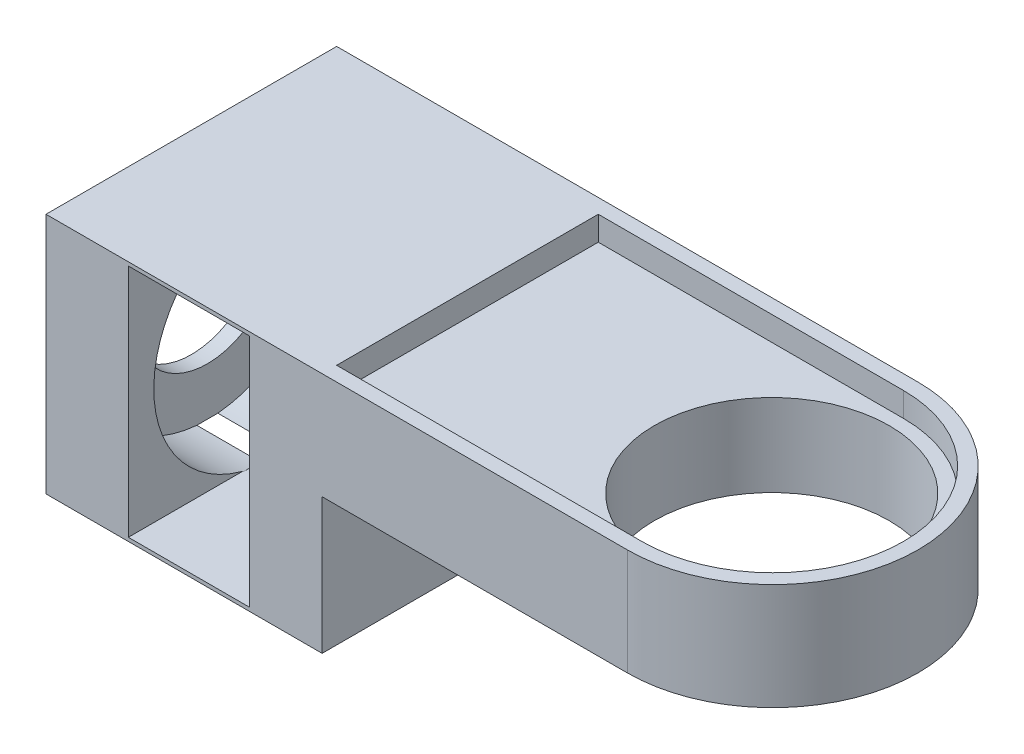
ISO-10303-21;
HEADER;
FILE_DESCRIPTION(('STEP AP214'),'2;1');
FILE_NAME('part.step','',(''),(''),'','','');
FILE_SCHEMA(('AUTOMOTIVE_DESIGN { 1 0 10303 214 1 1 1 1 }'));
ENDSEC;
DATA;
#1=APPLICATION_CONTEXT('core data for automotive mechanical design processes');
#2=APPLICATION_PROTOCOL_DEFINITION('international standard','automotive_design',2000,#1);
#3=PRODUCT_CONTEXT('',#1,'mechanical');
#4=PRODUCT('Part','Part','',(#3));
#5=PRODUCT_RELATED_PRODUCT_CATEGORY('part','',(#4));
#6=PRODUCT_DEFINITION_FORMATION('','',#4);
#7=PRODUCT_DEFINITION_CONTEXT('part definition',#1,'design');
#8=PRODUCT_DEFINITION('design','',#6,#7);
#9=PRODUCT_DEFINITION_SHAPE('','',#8);
#10=(LENGTH_UNIT() NAMED_UNIT(*) SI_UNIT(.MILLI.,.METRE.));
#11=(NAMED_UNIT(*) PLANE_ANGLE_UNIT() SI_UNIT($,.RADIAN.));
#12=(NAMED_UNIT(*) SI_UNIT($,.STERADIAN.) SOLID_ANGLE_UNIT());
#13=UNCERTAINTY_MEASURE_WITH_UNIT(LENGTH_MEASURE(1.E-05),#10,'distance_accuracy_value','');
#14=(GEOMETRIC_REPRESENTATION_CONTEXT(3) GLOBAL_UNCERTAINTY_ASSIGNED_CONTEXT((#13)) GLOBAL_UNIT_ASSIGNED_CONTEXT((#10,
#11,#12)) REPRESENTATION_CONTEXT('',''));
#15=CARTESIAN_POINT('',(0.,0.,0.));
#16=DIRECTION('',(0.,0.,1.));
#17=DIRECTION('',(1.,0.,0.));
#18=AXIS2_PLACEMENT_3D('',#15,#16,#17);
#19=CARTESIAN_POINT('',(0.,-56.,0.));
#20=DIRECTION('',(0.,-1.,0.));
#21=DIRECTION('',(0.,0.,-1.));
#22=AXIS2_PLACEMENT_3D('',#19,#20,#21);
#23=PLANE('',#22);
#24=DIRECTION('',(0.,0.,-1.));
#25=VECTOR('',#24,1.);
#26=CARTESIAN_POINT('',(-150.,-56.,-60.));
#27=LINE('',#26,#25);
#28=CARTESIAN_POINT('',(-150.,-56.,60.));
#29=VERTEX_POINT('',#28);
#30=CARTESIAN_POINT('',(-150.,-56.,-60.));
#31=VERTEX_POINT('',#30);
#32=EDGE_CURVE('E309',#29,#31,#27,.T.);
#33=ORIENTED_EDGE('',*,*,#32,.T.);
#34=DIRECTION('',(1.,0.,0.));
#35=VECTOR('',#34,1.);
#36=CARTESIAN_POINT('',(-36.,-56.,-60.));
#37=LINE('',#36,#35);
#38=CARTESIAN_POINT('',(-36.,-56.,-60.));
#39=VERTEX_POINT('',#38);
#40=EDGE_CURVE('E317',#31,#39,#37,.T.);
#41=ORIENTED_EDGE('',*,*,#40,.T.);
#42=DIRECTION('',(0.,0.,1.));
#43=VECTOR('',#42,1.);
#44=CARTESIAN_POINT('',(-36.,-56.,-60.));
#45=LINE('',#44,#43);
#46=CARTESIAN_POINT('',(-36.,-56.,60.));
#47=VERTEX_POINT('',#46);
#48=EDGE_CURVE('E314',#39,#47,#45,.T.);
#49=ORIENTED_EDGE('',*,*,#48,.T.);
#50=DIRECTION('',(-1.,0.,0.));
#51=VECTOR('',#50,1.);
#52=CARTESIAN_POINT('',(-36.,-56.,60.));
#53=LINE('',#52,#51);
#54=EDGE_CURVE('E304',#47,#29,#53,.T.);
#55=ORIENTED_EDGE('',*,*,#54,.T.);
#56=EDGE_LOOP('',(#33,#41,#49,#55));
#57=FACE_BOUND('',#56,.T.);
#58=DIRECTION('',(-1.,0.,0.));
#59=VECTOR('',#58,1.);
#60=CARTESIAN_POINT('',(-115.7,-56.,4.33047170531338));
#61=LINE('',#60,#59);
#62=CARTESIAN_POINT('',(-115.7,-56.,4.33047170531338));
#63=VERTEX_POINT('',#62);
#64=CARTESIAN_POINT('',(-143.4,-56.,4.33047170531338));
#65=VERTEX_POINT('',#64);
#66=EDGE_CURVE('E376',#63,#65,#61,.T.);
#67=ORIENTED_EDGE('',*,*,#66,.F.);
#68=DIRECTION('',(0.,0.,-1.));
#69=VECTOR('',#68,1.);
#70=CARTESIAN_POINT('',(-115.7,-56.,0.));
#71=LINE('',#70,#69);
#72=CARTESIAN_POINT('',(-115.7,-56.,-4.33047170531338));
#73=VERTEX_POINT('',#72);
#74=EDGE_CURVE('E394',#63,#73,#71,.T.);
#75=ORIENTED_EDGE('',*,*,#74,.T.);
#76=DIRECTION('',(-1.,0.,0.));
#77=VECTOR('',#76,1.);
#78=CARTESIAN_POINT('',(-115.7,-56.,-4.33047170531338));
#79=LINE('',#78,#77);
#80=CARTESIAN_POINT('',(-143.4,-56.,-4.33047170531338));
#81=VERTEX_POINT('',#80);
#82=EDGE_CURVE('E379',#81,#73,#79,.F.);
#83=ORIENTED_EDGE('',*,*,#82,.F.);
#84=DIRECTION('',(0.,0.,-1.));
#85=VECTOR('',#84,1.);
#86=CARTESIAN_POINT('',(-143.4,-56.,0.));
#87=LINE('',#86,#85);
#88=EDGE_CURVE('E11',#65,#81,#87,.T.);
#89=ORIENTED_EDGE('',*,*,#88,.F.);
#90=EDGE_LOOP('',(#67,#75,#83,#89));
#91=FACE_BOUND('',#90,.T.);
#92=ADVANCED_FACE('F45',(#57,#91),#23,.T.);
#93=CARTESIAN_POINT('',(-116.,-54.5,60.));
#94=DIRECTION('',(-1.,0.,0.));
#95=DIRECTION('',(0.,0.,1.));
#96=AXIS2_PLACEMENT_3D('',#93,#94,#95);
#97=PLANE('',#96);
#98=DIRECTION('',(0.,0.,-1.));
#99=VECTOR('',#98,1.);
#100=CARTESIAN_POINT('',(-116.,42.5,60.));
#101=LINE('',#100,#99);
#102=CARTESIAN_POINT('',(-116.,42.5,-5.53306098120269));
#103=VERTEX_POINT('',#102);
#104=CARTESIAN_POINT('',(-116.,42.5,-60.));
#105=VERTEX_POINT('',#104);
#106=EDGE_CURVE('E326',#103,#105,#101,.T.);
#107=ORIENTED_EDGE('',*,*,#106,.F.);
#108=CARTESIAN_POINT('',(-116.,-6.68978792573002,0.));
#109=DIRECTION('',(-1.,0.,0.));
#110=DIRECTION('',(0.,0.,1.));
#111=AXIS2_PLACEMENT_3D('',#108,#109,#110);
#112=CIRCLE('',#111,49.5);
#113=CARTESIAN_POINT('',(-116.,-54.5,-12.8231673705575));
#114=VERTEX_POINT('',#113);
#115=EDGE_CURVE('E386',#103,#114,#112,.T.);
#116=ORIENTED_EDGE('',*,*,#115,.T.);
#117=DIRECTION('',(0.,0.,-1.));
#118=VECTOR('',#117,1.);
#119=CARTESIAN_POINT('',(-116.,-54.5,60.));
#120=LINE('',#119,#118);
#121=CARTESIAN_POINT('',(-116.,-54.5,-60.));
#122=VERTEX_POINT('',#121);
#123=EDGE_CURVE('E332',#114,#122,#120,.T.);
#124=ORIENTED_EDGE('',*,*,#123,.T.);
#125=DIRECTION('',(0.,1.,0.));
#126=VECTOR('',#125,1.);
#127=CARTESIAN_POINT('',(-116.,-54.5,-60.));
#128=LINE('',#127,#126);
#129=EDGE_CURVE('E349',#122,#105,#128,.T.);
#130=ORIENTED_EDGE('',*,*,#129,.T.);
#131=EDGE_LOOP('',(#107,#116,#124,#130));
#132=FACE_BOUND('',#131,.T.);
#133=ADVANCED_FACE('F436',(#132),#97,.F.);
#134=CARTESIAN_POINT('',(0.,34.,0.));
#135=DIRECTION('',(0.,-1.,0.));
#136=DIRECTION('',(0.,0.,-1.));
#137=AXIS2_PLACEMENT_3D('',#134,#135,#136);
#138=PLANE('',#137);
#139=CARTESIAN_POINT('',(89.6141562301881,34.,0.));
#140=DIRECTION('',(0.,1.,0.));
#141=DIRECTION('',(0.,0.,1.));
#142=AXIS2_PLACEMENT_3D('',#139,#140,#141);
#143=CIRCLE('',#142,48.5);
#144=CARTESIAN_POINT('',(89.6141562301881,34.,48.5));
#145=VERTEX_POINT('',#144);
#146=EDGE_CURVE('E229',#145,#145,#143,.T.);
#147=ORIENTED_EDGE('',*,*,#146,.F.);
#148=EDGE_LOOP('',(#147));
#149=FACE_BOUND('',#148,.T.);
#150=DIRECTION('',(0.,0.,-1.));
#151=VECTOR('',#150,1.);
#152=CARTESIAN_POINT('',(-36.,34.,-54.));
#153=LINE('',#152,#151);
#154=CARTESIAN_POINT('',(-36.,34.,54.));
#155=VERTEX_POINT('',#154);
#156=CARTESIAN_POINT('',(-35.9999999999999,34.,-54.));
#157=VERTEX_POINT('',#156);
#158=EDGE_CURVE('E289',#155,#157,#153,.T.);
#159=ORIENTED_EDGE('',*,*,#158,.F.);
#160=DIRECTION('',(1.,0.,0.));
#161=VECTOR('',#160,1.);
#162=CARTESIAN_POINT('',(-144.,34.,54.));
#163=LINE('',#162,#161);
#164=CARTESIAN_POINT('',(90.,34.,54.));
#165=VERTEX_POINT('',#164);
#166=EDGE_CURVE('E270',#155,#165,#163,.T.);
#167=ORIENTED_EDGE('',*,*,#166,.T.);
#168=CARTESIAN_POINT('',(90.,34.,0.));
#169=DIRECTION('',(0.,1.,0.));
#170=DIRECTION('',(0.,0.,1.));
#171=AXIS2_PLACEMENT_3D('',#168,#169,#170);
#172=CIRCLE('',#171,54.);
#173=CARTESIAN_POINT('',(90.,34.,-54.));
#174=VERTEX_POINT('',#173);
#175=EDGE_CURVE('E266',#165,#174,#172,.T.);
#176=ORIENTED_EDGE('',*,*,#175,.T.);
#177=DIRECTION('',(-1.,0.,0.));
#178=VECTOR('',#177,1.);
#179=CARTESIAN_POINT('',(90.,34.,-54.));
#180=LINE('',#179,#178);
#181=EDGE_CURVE('E261',#174,#157,#180,.T.);
#182=ORIENTED_EDGE('',*,*,#181,.T.);
#183=EDGE_LOOP('',(#159,#167,#176,#182));
#184=FACE_BOUND('',#183,.T.);
#185=ADVANCED_FACE('F442',(#149,#184),#138,.F.);
#186=CARTESIAN_POINT('',(-144.,44.,54.));
#187=DIRECTION('',(0.,0.,-1.));
#188=DIRECTION('',(-1.,0.,0.));
#189=AXIS2_PLACEMENT_3D('',#186,#187,#188);
#190=PLANE('',#189);
#191=ORIENTED_EDGE('',*,*,#166,.F.);
#192=DIRECTION('',(0.,-1.,0.));
#193=VECTOR('',#192,1.);
#194=CARTESIAN_POINT('',(-36.,44.,54.));
#195=LINE('',#194,#193);
#196=CARTESIAN_POINT('',(-36.,44.,54.));
#197=VERTEX_POINT('',#196);
#198=EDGE_CURVE('E273',#197,#155,#195,.T.);
#199=ORIENTED_EDGE('',*,*,#198,.F.);
#200=DIRECTION('',(1.,0.,0.));
#201=VECTOR('',#200,1.);
#202=CARTESIAN_POINT('',(-144.,44.,54.));
#203=LINE('',#202,#201);
#204=CARTESIAN_POINT('',(90.,44.,54.));
#205=VERTEX_POINT('',#204);
#206=EDGE_CURVE('E265',#197,#205,#203,.T.);
#207=ORIENTED_EDGE('',*,*,#206,.T.);
#208=DIRECTION('',(0.,-1.,0.));
#209=VECTOR('',#208,1.);
#210=CARTESIAN_POINT('',(90.,44.,54.));
#211=LINE('',#210,#209);
#212=EDGE_CURVE('E253',#205,#165,#211,.T.);
#213=ORIENTED_EDGE('',*,*,#212,.T.);
#214=EDGE_LOOP('',(#191,#199,#207,#213));
#215=FACE_BOUND('',#214,.T.);
#216=ADVANCED_FACE('F448',(#215),#190,.T.);
#217=CARTESIAN_POINT('',(90.,44.,-54.));
#218=DIRECTION('',(0.,0.,1.));
#219=DIRECTION('',(1.,0.,0.));
#220=AXIS2_PLACEMENT_3D('',#217,#218,#219);
#221=PLANE('',#220);
#222=DIRECTION('',(-1.,0.,0.));
#223=VECTOR('',#222,1.);
#224=CARTESIAN_POINT('',(90.,44.,-54.));
#225=LINE('',#224,#223);
#226=CARTESIAN_POINT('',(90.,44.,-54.));
#227=VERTEX_POINT('',#226);
#228=CARTESIAN_POINT('',(-35.9999999999999,44.,-54.));
#229=VERTEX_POINT('',#228);
#230=EDGE_CURVE('E260',#227,#229,#225,.T.);
#231=ORIENTED_EDGE('',*,*,#230,.T.);
#232=DIRECTION('',(0.,-1.,0.));
#233=VECTOR('',#232,1.);
#234=CARTESIAN_POINT('',(-36.,44.,-54.));
#235=LINE('',#234,#233);
#236=EDGE_CURVE('E285',#229,#157,#235,.T.);
#237=ORIENTED_EDGE('',*,*,#236,.T.);
#238=ORIENTED_EDGE('',*,*,#181,.F.);
#239=DIRECTION('',(0.,-1.,0.));
#240=VECTOR('',#239,1.);
#241=CARTESIAN_POINT('',(90.,44.,-54.));
#242=LINE('',#241,#240);
#243=EDGE_CURVE('E257',#227,#174,#242,.T.);
#244=ORIENTED_EDGE('',*,*,#243,.F.);
#245=EDGE_LOOP('',(#231,#237,#238,#244));
#246=FACE_BOUND('',#245,.T.);
#247=ADVANCED_FACE('F471',(#246),#221,.T.);
#248=CARTESIAN_POINT('',(90.,34.,0.));
#249=DIRECTION('',(0.,-1.,0.));
#250=DIRECTION('',(0.,0.,-1.));
#251=AXIS2_PLACEMENT_3D('',#248,#249,#250);
#252=CYLINDRICAL_SURFACE('',#251,60.);
#253=DIRECTION('',(0.,-1.,0.));
#254=VECTOR('',#253,1.);
#255=CARTESIAN_POINT('',(90.,34.,-60.));
#256=LINE('',#255,#254);
#257=CARTESIAN_POINT('',(90.,44.,-60.));
#258=VERTEX_POINT('',#257);
#259=CARTESIAN_POINT('',(90.,0.,-60.));
#260=VERTEX_POINT('',#259);
#261=EDGE_CURVE('E212',#258,#260,#256,.T.);
#262=ORIENTED_EDGE('',*,*,#261,.F.);
#263=CARTESIAN_POINT('',(90.,44.,0.));
#264=DIRECTION('',(0.,1.,0.));
#265=DIRECTION('',(0.,0.,1.));
#266=AXIS2_PLACEMENT_3D('',#263,#264,#265);
#267=CIRCLE('',#266,60.);
#268=CARTESIAN_POINT('',(90.,44.,60.));
#269=VERTEX_POINT('',#268);
#270=EDGE_CURVE('E241',#269,#258,#267,.T.);
#271=ORIENTED_EDGE('',*,*,#270,.F.);
#272=DIRECTION('',(0.,-1.,0.));
#273=VECTOR('',#272,1.);
#274=CARTESIAN_POINT('',(90.,34.,60.));
#275=LINE('',#274,#273);
#276=CARTESIAN_POINT('',(90.,0.,60.));
#277=VERTEX_POINT('',#276);
#278=EDGE_CURVE('E209',#277,#269,#275,.F.);
#279=ORIENTED_EDGE('',*,*,#278,.F.);
#280=CARTESIAN_POINT('',(90.,0.,0.));
#281=DIRECTION('',(0.,-1.,0.));
#282=DIRECTION('',(0.,0.,-1.));
#283=AXIS2_PLACEMENT_3D('',#280,#281,#282);
#284=CIRCLE('',#283,60.);
#285=EDGE_CURVE('E188',#260,#277,#284,.T.);
#286=ORIENTED_EDGE('',*,*,#285,.F.);
#287=EDGE_LOOP('',(#262,#271,#279,#286));
#288=FACE_BOUND('',#287,.T.);
#289=ADVANCED_FACE('F48',(#288),#252,.T.);
#290=CARTESIAN_POINT('',(0.,0.,0.));
#291=DIRECTION('',(0.,-1.,0.));
#292=DIRECTION('',(0.,0.,-1.));
#293=AXIS2_PLACEMENT_3D('',#290,#291,#292);
#294=PLANE('',#293);
#295=DIRECTION('',(0.,0.,1.));
#296=VECTOR('',#295,1.);
#297=CARTESIAN_POINT('',(-36.,0.,-60.));
#298=LINE('',#297,#296);
#299=CARTESIAN_POINT('',(-36.,0.,-60.));
#300=VERTEX_POINT('',#299);
#301=CARTESIAN_POINT('',(-36.,0.,60.));
#302=VERTEX_POINT('',#301);
#303=EDGE_CURVE('E305',#300,#302,#298,.T.);
#304=ORIENTED_EDGE('',*,*,#303,.F.);
#305=DIRECTION('',(-1.,0.,0.));
#306=VECTOR('',#305,1.);
#307=CARTESIAN_POINT('',(-150.,0.,-60.));
#308=LINE('',#307,#306);
#309=EDGE_CURVE('E225',#260,#300,#308,.T.);
#310=ORIENTED_EDGE('',*,*,#309,.F.);
#311=ORIENTED_EDGE('',*,*,#285,.T.);
#312=DIRECTION('',(1.,0.,0.));
#313=VECTOR('',#312,1.);
#314=CARTESIAN_POINT('',(-150.,0.,60.));
#315=LINE('',#314,#313);
#316=EDGE_CURVE('E222',#302,#277,#315,.T.);
#317=ORIENTED_EDGE('',*,*,#316,.F.);
#318=EDGE_LOOP('',(#304,#310,#311,#317));
#319=FACE_BOUND('',#318,.T.);
#320=CARTESIAN_POINT('',(89.6141562301881,0.,0.));
#321=DIRECTION('',(0.,1.,0.));
#322=DIRECTION('',(0.,0.,1.));
#323=AXIS2_PLACEMENT_3D('',#320,#321,#322);
#324=CIRCLE('',#323,48.5);
#325=CARTESIAN_POINT('',(89.6141562301881,0.,48.5));
#326=VERTEX_POINT('',#325);
#327=EDGE_CURVE('E230',#326,#326,#324,.T.);
#328=ORIENTED_EDGE('',*,*,#327,.T.);
#329=EDGE_LOOP('',(#328));
#330=FACE_BOUND('',#329,.T.);
#331=ADVANCED_FACE('F489',(#319,#330),#294,.T.);
#332=CARTESIAN_POINT('',(-150.,34.,-60.));
#333=DIRECTION('',(0.,0.,1.));
#334=DIRECTION('',(1.,0.,0.));
#335=AXIS2_PLACEMENT_3D('',#332,#333,#334);
#336=PLANE('',#335);
#337=DIRECTION('',(1.,0.,0.));
#338=VECTOR('',#337,1.);
#339=CARTESIAN_POINT('',(-66.,42.5,-60.));
#340=LINE('',#339,#338);
#341=CARTESIAN_POINT('',(-66.,42.5,-60.));
#342=VERTEX_POINT('',#341);
#343=EDGE_CURVE('E345',#105,#342,#340,.T.);
#344=ORIENTED_EDGE('',*,*,#343,.F.);
#345=ORIENTED_EDGE('',*,*,#129,.F.);
#346=DIRECTION('',(-1.,0.,0.));
#347=VECTOR('',#346,1.);
#348=CARTESIAN_POINT('',(-66.,-54.5,-60.));
#349=LINE('',#348,#347);
#350=CARTESIAN_POINT('',(-66.,-54.5,-60.));
#351=VERTEX_POINT('',#350);
#352=EDGE_CURVE('E336',#351,#122,#349,.T.);
#353=ORIENTED_EDGE('',*,*,#352,.F.);
#354=DIRECTION('',(0.,-1.,0.));
#355=VECTOR('',#354,1.);
#356=CARTESIAN_POINT('',(-66.,-54.5,-60.));
#357=LINE('',#356,#355);
#358=EDGE_CURVE('E341',#342,#351,#357,.T.);
#359=ORIENTED_EDGE('',*,*,#358,.F.);
#360=EDGE_LOOP('',(#344,#345,#353,#359));
#361=FACE_BOUND('',#360,.T.);
#362=DIRECTION('',(0.,-1.,0.));
#363=VECTOR('',#362,1.);
#364=CARTESIAN_POINT('',(-150.,34.,-60.));
#365=LINE('',#364,#363);
#366=CARTESIAN_POINT('',(-150.,44.,-60.));
#367=VERTEX_POINT('',#366);
#368=EDGE_CURVE('E216',#367,#31,#365,.T.);
#369=ORIENTED_EDGE('',*,*,#368,.F.);
#370=DIRECTION('',(-1.,0.,0.));
#371=VECTOR('',#370,1.);
#372=CARTESIAN_POINT('',(90.,44.,-60.));
#373=LINE('',#372,#371);
#374=EDGE_CURVE('E234',#258,#367,#373,.T.);
#375=ORIENTED_EDGE('',*,*,#374,.F.);
#376=ORIENTED_EDGE('',*,*,#261,.T.);
#377=ORIENTED_EDGE('',*,*,#309,.T.);
#378=DIRECTION('',(0.,1.,0.));
#379=VECTOR('',#378,1.);
#380=CARTESIAN_POINT('',(-36.,-56.,-60.));
#381=LINE('',#380,#379);
#382=EDGE_CURVE('E293',#39,#300,#381,.T.);
#383=ORIENTED_EDGE('',*,*,#382,.F.);
#384=ORIENTED_EDGE('',*,*,#40,.F.);
#385=EDGE_LOOP('',(#369,#375,#376,#377,#383,#384));
#386=FACE_BOUND('',#385,.T.);
#387=ADVANCED_FACE('F432',(#361,#386),#336,.F.);
#388=CARTESIAN_POINT('',(-150.,34.,60.));
#389=DIRECTION('',(1.,0.,0.));
#390=DIRECTION('',(0.,0.,-1.));
#391=AXIS2_PLACEMENT_3D('',#388,#389,#390);
#392=PLANE('',#391);
#393=CARTESIAN_POINT('',(-150.,-6.68978792573002,0.));
#394=DIRECTION('',(-1.,0.,0.));
#395=DIRECTION('',(0.,0.,1.));
#396=AXIS2_PLACEMENT_3D('',#393,#394,#395);
#397=CIRCLE('',#396,29.5);
#398=CARTESIAN_POINT('',(-150.,-6.68978792573002,29.5));
#399=VERTEX_POINT('',#398);
#400=EDGE_CURVE('E353',#399,#399,#397,.T.);
#401=ORIENTED_EDGE('',*,*,#400,.F.);
#402=EDGE_LOOP('',(#401));
#403=FACE_BOUND('',#402,.T.);
#404=ORIENTED_EDGE('',*,*,#368,.T.);
#405=ORIENTED_EDGE('',*,*,#32,.F.);
#406=DIRECTION('',(0.,-1.,0.));
#407=VECTOR('',#406,1.);
#408=CARTESIAN_POINT('',(-150.,34.,60.));
#409=LINE('',#408,#407);
#410=CARTESIAN_POINT('',(-150.,44.,60.));
#411=VERTEX_POINT('',#410);
#412=EDGE_CURVE('E219',#411,#29,#409,.T.);
#413=ORIENTED_EDGE('',*,*,#412,.F.);
#414=DIRECTION('',(0.,0.,1.));
#415=VECTOR('',#414,1.);
#416=CARTESIAN_POINT('',(-150.,44.,-60.));
#417=LINE('',#416,#415);
#418=EDGE_CURVE('E249',#367,#411,#417,.T.);
#419=ORIENTED_EDGE('',*,*,#418,.F.);
#420=EDGE_LOOP('',(#404,#405,#413,#419));
#421=FACE_BOUND('',#420,.T.);
#422=ADVANCED_FACE('F495',(#403,#421),#392,.F.);
#423=CARTESIAN_POINT('',(-150.,34.,60.));
#424=DIRECTION('',(0.,0.,-1.));
#425=DIRECTION('',(-1.,0.,0.));
#426=AXIS2_PLACEMENT_3D('',#423,#424,#425);
#427=PLANE('',#426);
#428=DIRECTION('',(-1.,0.,0.));
#429=VECTOR('',#428,1.);
#430=CARTESIAN_POINT('',(-66.,-54.5,60.));
#431=LINE('',#430,#429);
#432=CARTESIAN_POINT('',(-66.,-54.5,60.));
#433=VERTEX_POINT('',#432);
#434=CARTESIAN_POINT('',(-116.,-54.5,60.));
#435=VERTEX_POINT('',#434);
#436=EDGE_CURVE('E354',#433,#435,#431,.T.);
#437=ORIENTED_EDGE('',*,*,#436,.T.);
#438=DIRECTION('',(0.,1.,0.));
#439=VECTOR('',#438,1.);
#440=CARTESIAN_POINT('',(-116.,-54.5,60.));
#441=LINE('',#440,#439);
#442=CARTESIAN_POINT('',(-116.,42.5,60.));
#443=VERTEX_POINT('',#442);
#444=EDGE_CURVE('E340',#435,#443,#441,.T.);
#445=ORIENTED_EDGE('',*,*,#444,.T.);
#446=DIRECTION('',(1.,0.,0.));
#447=VECTOR('',#446,1.);
#448=CARTESIAN_POINT('',(-66.,42.5,60.));
#449=LINE('',#448,#447);
#450=CARTESIAN_POINT('',(-66.,42.5,60.));
#451=VERTEX_POINT('',#450);
#452=EDGE_CURVE('E362',#443,#451,#449,.T.);
#453=ORIENTED_EDGE('',*,*,#452,.T.);
#454=DIRECTION('',(0.,-1.,0.));
#455=VECTOR('',#454,1.);
#456=CARTESIAN_POINT('',(-66.,-54.5,60.));
#457=LINE('',#456,#455);
#458=EDGE_CURVE('E358',#451,#433,#457,.T.);
#459=ORIENTED_EDGE('',*,*,#458,.T.);
#460=EDGE_LOOP('',(#437,#445,#453,#459));
#461=FACE_BOUND('',#460,.T.);
#462=ORIENTED_EDGE('',*,*,#412,.T.);
#463=ORIENTED_EDGE('',*,*,#54,.F.);
#464=DIRECTION('',(0.,1.,0.));
#465=VECTOR('',#464,1.);
#466=CARTESIAN_POINT('',(-36.,-56.,60.));
#467=LINE('',#466,#465);
#468=EDGE_CURVE('E300',#47,#302,#467,.T.);
#469=ORIENTED_EDGE('',*,*,#468,.T.);
#470=ORIENTED_EDGE('',*,*,#316,.T.);
#471=ORIENTED_EDGE('',*,*,#278,.T.);
#472=DIRECTION('',(1.,0.,0.));
#473=VECTOR('',#472,1.);
#474=CARTESIAN_POINT('',(-150.,44.,60.));
#475=LINE('',#474,#473);
#476=EDGE_CURVE('E245',#411,#269,#475,.T.);
#477=ORIENTED_EDGE('',*,*,#476,.F.);
#478=EDGE_LOOP('',(#462,#463,#469,#470,#471,#477));
#479=FACE_BOUND('',#478,.T.);
#480=ADVANCED_FACE('F421',(#461,#479),#427,.F.);
#481=CARTESIAN_POINT('',(89.6141562301881,34.,0.));
#482=DIRECTION('',(0.,-1.,0.));
#483=DIRECTION('',(0.,0.,-1.));
#484=AXIS2_PLACEMENT_3D('',#481,#482,#483);
#485=CYLINDRICAL_SURFACE('',#484,48.5);
#486=ORIENTED_EDGE('',*,*,#146,.T.);
#487=EDGE_LOOP('',(#486));
#488=FACE_BOUND('',#487,.T.);
#489=ORIENTED_EDGE('',*,*,#327,.F.);
#490=EDGE_LOOP('',(#489));
#491=FACE_BOUND('',#490,.T.);
#492=ADVANCED_FACE('F484',(#488,#491),#485,.F.);
#493=CARTESIAN_POINT('',(90.,44.,0.));
#494=DIRECTION('',(0.,1.,0.));
#495=DIRECTION('',(0.,0.,1.));
#496=AXIS2_PLACEMENT_3D('',#493,#494,#495);
#497=PLANE('',#496);
#498=ORIENTED_EDGE('',*,*,#206,.F.);
#499=DIRECTION('',(0.,0.,-1.));
#500=VECTOR('',#499,1.);
#501=CARTESIAN_POINT('',(-36.,44.,-54.));
#502=LINE('',#501,#500);
#503=EDGE_CURVE('E288',#197,#229,#502,.T.);
#504=ORIENTED_EDGE('',*,*,#503,.T.);
#505=ORIENTED_EDGE('',*,*,#230,.F.);
#506=CARTESIAN_POINT('',(90.,44.,0.));
#507=DIRECTION('',(0.,1.,0.));
#508=DIRECTION('',(0.,0.,1.));
#509=AXIS2_PLACEMENT_3D('',#506,#507,#508);
#510=CIRCLE('',#509,54.);
#511=EDGE_CURVE('E276',#205,#227,#510,.T.);
#512=ORIENTED_EDGE('',*,*,#511,.F.);
#513=EDGE_LOOP('',(#498,#504,#505,#512));
#514=FACE_BOUND('',#513,.T.);
#515=ORIENTED_EDGE('',*,*,#418,.T.);
#516=ORIENTED_EDGE('',*,*,#476,.T.);
#517=ORIENTED_EDGE('',*,*,#270,.T.);
#518=ORIENTED_EDGE('',*,*,#374,.T.);
#519=EDGE_LOOP('',(#515,#516,#517,#518));
#520=FACE_BOUND('',#519,.T.);
#521=ADVANCED_FACE('F477',(#514,#520),#497,.T.);
#522=CARTESIAN_POINT('',(90.,44.,0.));
#523=DIRECTION('',(0.,-1.,0.));
#524=DIRECTION('',(0.,0.,-1.));
#525=AXIS2_PLACEMENT_3D('',#522,#523,#524);
#526=CYLINDRICAL_SURFACE('',#525,54.);
#527=ORIENTED_EDGE('',*,*,#175,.F.);
#528=ORIENTED_EDGE('',*,*,#212,.F.);
#529=ORIENTED_EDGE('',*,*,#511,.T.);
#530=ORIENTED_EDGE('',*,*,#243,.T.);
#531=EDGE_LOOP('',(#527,#528,#529,#530));
#532=FACE_BOUND('',#531,.T.);
#533=ADVANCED_FACE('F467',(#532),#526,.F.);
#534=CARTESIAN_POINT('',(-36.,44.,-54.));
#535=DIRECTION('',(-1.,0.,0.));
#536=DIRECTION('',(0.,0.,1.));
#537=AXIS2_PLACEMENT_3D('',#534,#535,#536);
#538=PLANE('',#537);
#539=ORIENTED_EDGE('',*,*,#158,.T.);
#540=ORIENTED_EDGE('',*,*,#236,.F.);
#541=ORIENTED_EDGE('',*,*,#503,.F.);
#542=ORIENTED_EDGE('',*,*,#198,.T.);
#543=EDGE_LOOP('',(#539,#540,#541,#542));
#544=FACE_BOUND('',#543,.T.);
#545=ADVANCED_FACE('F461',(#544),#538,.F.);
#546=CARTESIAN_POINT('',(-36.,-56.,-60.));
#547=DIRECTION('',(-1.,0.,0.));
#548=DIRECTION('',(0.,0.,1.));
#549=AXIS2_PLACEMENT_3D('',#546,#547,#548);
#550=PLANE('',#549);
#551=ORIENTED_EDGE('',*,*,#303,.T.);
#552=ORIENTED_EDGE('',*,*,#468,.F.);
#553=ORIENTED_EDGE('',*,*,#48,.F.);
#554=ORIENTED_EDGE('',*,*,#382,.T.);
#555=EDGE_LOOP('',(#551,#552,#553,#554));
#556=FACE_BOUND('',#555,.T.);
#557=ADVANCED_FACE('F455',(#556),#550,.F.);
#558=CARTESIAN_POINT('',(-116.,-54.5,12.8231673705575));
#559=VERTEX_POINT('',#558);
#560=EDGE_CURVE('E310',#435,#559,#120,.T.);
#561=ORIENTED_EDGE('',*,*,#560,.T.);
#562=CARTESIAN_POINT('',(-116.,42.5,5.53306098120269));
#563=VERTEX_POINT('',#562);
#564=EDGE_CURVE('E391',#559,#563,#112,.T.);
#565=ORIENTED_EDGE('',*,*,#564,.T.);
#566=EDGE_CURVE('E201',#443,#563,#101,.T.);
#567=ORIENTED_EDGE('',*,*,#566,.F.);
#568=ORIENTED_EDGE('',*,*,#444,.F.);
#569=EDGE_LOOP('',(#561,#565,#567,#568));
#570=FACE_BOUND('',#569,.T.);
#571=ADVANCED_FACE('F419',(#570),#97,.F.);
#572=CARTESIAN_POINT('',(-66.,-54.5,60.));
#573=DIRECTION('',(0.,-1.,0.));
#574=DIRECTION('',(0.,0.,-1.));
#575=AXIS2_PLACEMENT_3D('',#572,#573,#574);
#576=PLANE('',#575);
#577=DIRECTION('',(0.,0.,-1.));
#578=VECTOR('',#577,1.);
#579=CARTESIAN_POINT('',(-115.7,-54.5,60.));
#580=LINE('',#579,#578);
#581=CARTESIAN_POINT('',(-115.7,-54.5,12.8231673705575));
#582=VERTEX_POINT('',#581);
#583=CARTESIAN_POINT('',(-115.7,-54.5,-12.8231673705575));
#584=VERTEX_POINT('',#583);
#585=EDGE_CURVE('E194',#582,#584,#580,.T.);
#586=ORIENTED_EDGE('',*,*,#585,.F.);
#587=DIRECTION('',(-1.,0.,0.));
#588=VECTOR('',#587,1.);
#589=CARTESIAN_POINT('',(-115.7,-54.5,12.8231673705575));
#590=LINE('',#589,#588);
#591=EDGE_CURVE('E387',#582,#559,#590,.T.);
#592=ORIENTED_EDGE('',*,*,#591,.T.);
#593=ORIENTED_EDGE('',*,*,#560,.F.);
#594=ORIENTED_EDGE('',*,*,#436,.F.);
#595=DIRECTION('',(0.,0.,-1.));
#596=VECTOR('',#595,1.);
#597=CARTESIAN_POINT('',(-66.,-54.5,60.));
#598=LINE('',#597,#596);
#599=EDGE_CURVE('E329',#433,#351,#598,.T.);
#600=ORIENTED_EDGE('',*,*,#599,.T.);
#601=ORIENTED_EDGE('',*,*,#352,.T.);
#602=ORIENTED_EDGE('',*,*,#123,.F.);
#603=DIRECTION('',(-1.,0.,0.));
#604=VECTOR('',#603,1.);
#605=CARTESIAN_POINT('',(-115.7,-54.5,-12.8231673705575));
#606=LINE('',#605,#604);
#607=EDGE_CURVE('E382',#114,#584,#606,.F.);
#608=ORIENTED_EDGE('',*,*,#607,.T.);
#609=EDGE_LOOP('',(#586,#592,#593,#594,#600,#601,#602,#608));
#610=FACE_BOUND('',#609,.T.);
#611=ADVANCED_FACE('F415',(#610),#576,.F.);
#612=CARTESIAN_POINT('',(-66.,-54.5,60.));
#613=DIRECTION('',(1.,0.,0.));
#614=DIRECTION('',(0.,0.,-1.));
#615=AXIS2_PLACEMENT_3D('',#612,#613,#614);
#616=PLANE('',#615);
#617=ORIENTED_EDGE('',*,*,#358,.T.);
#618=ORIENTED_EDGE('',*,*,#599,.F.);
#619=ORIENTED_EDGE('',*,*,#458,.F.);
#620=DIRECTION('',(0.,0.,-1.));
#621=VECTOR('',#620,1.);
#622=CARTESIAN_POINT('',(-66.,42.5,60.));
#623=LINE('',#622,#621);
#624=EDGE_CURVE('E325',#451,#342,#623,.T.);
#625=ORIENTED_EDGE('',*,*,#624,.T.);
#626=EDGE_LOOP('',(#617,#618,#619,#625));
#627=FACE_BOUND('',#626,.T.);
#628=ADVANCED_FACE('F428',(#627),#616,.F.);
#629=CARTESIAN_POINT('',(-66.,42.5,60.));
#630=DIRECTION('',(0.,1.,0.));
#631=DIRECTION('',(0.,0.,1.));
#632=AXIS2_PLACEMENT_3D('',#629,#630,#631);
#633=PLANE('',#632);
#634=DIRECTION('',(0.,0.,1.));
#635=VECTOR('',#634,1.);
#636=CARTESIAN_POINT('',(-115.7,42.5,60.));
#637=LINE('',#636,#635);
#638=CARTESIAN_POINT('',(-115.7,42.5,-5.53306098120257));
#639=VERTEX_POINT('',#638);
#640=CARTESIAN_POINT('',(-115.7,42.5,5.53306098120257));
#641=VERTEX_POINT('',#640);
#642=EDGE_CURVE('E181',#639,#641,#637,.T.);
#643=ORIENTED_EDGE('',*,*,#642,.F.);
#644=DIRECTION('',(-1.,0.,0.));
#645=VECTOR('',#644,1.);
#646=CARTESIAN_POINT('',(-115.7,42.5,-5.53306098120269));
#647=LINE('',#646,#645);
#648=EDGE_CURVE('E55',#639,#103,#647,.T.);
#649=ORIENTED_EDGE('',*,*,#648,.T.);
#650=ORIENTED_EDGE('',*,*,#106,.T.);
#651=ORIENTED_EDGE('',*,*,#343,.T.);
#652=ORIENTED_EDGE('',*,*,#624,.F.);
#653=ORIENTED_EDGE('',*,*,#452,.F.);
#654=ORIENTED_EDGE('',*,*,#566,.T.);
#655=DIRECTION('',(-1.,0.,0.));
#656=VECTOR('',#655,1.);
#657=CARTESIAN_POINT('',(-115.7,42.5,5.53306098120269));
#658=LINE('',#657,#656);
#659=EDGE_CURVE('E187',#563,#641,#658,.F.);
#660=ORIENTED_EDGE('',*,*,#659,.T.);
#661=EDGE_LOOP('',(#643,#649,#650,#651,#652,#653,#654,#660));
#662=FACE_BOUND('',#661,.T.);
#663=ADVANCED_FACE('F199',(#662),#633,.F.);
#664=CARTESIAN_POINT('',(-143.4,-6.68978792573002,0.));
#665=DIRECTION('',(-1.,0.,0.));
#666=DIRECTION('',(0.,0.,1.));
#667=AXIS2_PLACEMENT_3D('',#664,#665,#666);
#668=CYLINDRICAL_SURFACE('',#667,29.5);
#669=CARTESIAN_POINT('',(-143.4,-6.68978792573002,0.));
#670=DIRECTION('',(-1.,0.,0.));
#671=DIRECTION('',(0.,0.,1.));
#672=AXIS2_PLACEMENT_3D('',#669,#670,#671);
#673=CIRCLE('',#672,29.5);
#674=CARTESIAN_POINT('',(-143.4,-6.68978792573002,29.5));
#675=VERTEX_POINT('',#674);
#676=EDGE_CURVE('E372',#675,#675,#673,.T.);
#677=ORIENTED_EDGE('',*,*,#676,.F.);
#678=EDGE_LOOP('',(#677));
#679=FACE_BOUND('',#678,.T.);
#680=ORIENTED_EDGE('',*,*,#400,.T.);
#681=EDGE_LOOP('',(#680));
#682=FACE_BOUND('',#681,.T.);
#683=ADVANCED_FACE('F581',(#679,#682),#668,.F.);
#684=CARTESIAN_POINT('',(-115.7,-6.68978792573002,0.));
#685=DIRECTION('',(-1.,0.,0.));
#686=DIRECTION('',(0.,0.,1.));
#687=AXIS2_PLACEMENT_3D('',#684,#685,#686);
#688=CYLINDRICAL_SURFACE('',#687,49.5);
#689=ORIENTED_EDGE('',*,*,#66,.T.);
#690=CARTESIAN_POINT('',(-143.4,-6.68978792573002,0.));
#691=DIRECTION('',(-1.,0.,0.));
#692=DIRECTION('',(0.,0.,1.));
#693=AXIS2_PLACEMENT_3D('',#690,#691,#692);
#694=CIRCLE('',#693,49.5);
#695=EDGE_CURVE('E60',#65,#81,#694,.T.);
#696=ORIENTED_EDGE('',*,*,#695,.T.);
#697=ORIENTED_EDGE('',*,*,#82,.T.);
#698=CARTESIAN_POINT('',(-115.7,-6.68978792573002,0.));
#699=DIRECTION('',(-1.,0.,0.));
#700=DIRECTION('',(0.,0.,1.));
#701=AXIS2_PLACEMENT_3D('',#698,#699,#700);
#702=CIRCLE('',#701,49.5);
#703=EDGE_CURVE('E195',#584,#73,#702,.T.);
#704=ORIENTED_EDGE('',*,*,#703,.F.);
#705=ORIENTED_EDGE('',*,*,#607,.F.);
#706=ORIENTED_EDGE('',*,*,#115,.F.);
#707=ORIENTED_EDGE('',*,*,#648,.F.);
#708=EDGE_CURVE('E67',#641,#639,#702,.T.);
#709=ORIENTED_EDGE('',*,*,#708,.F.);
#710=ORIENTED_EDGE('',*,*,#659,.F.);
#711=ORIENTED_EDGE('',*,*,#564,.F.);
#712=ORIENTED_EDGE('',*,*,#591,.F.);
#713=EDGE_CURVE('E197',#63,#582,#702,.T.);
#714=ORIENTED_EDGE('',*,*,#713,.F.);
#715=EDGE_LOOP('',(#689,#696,#697,#704,#705,#706,#707,#709,#710,#711,#712,#714));
#716=FACE_BOUND('',#715,.T.);
#717=ADVANCED_FACE('F191',(#716),#688,.F.);
#718=CARTESIAN_POINT('',(-115.7,-6.68978792573002,0.));
#719=DIRECTION('',(-1.,0.,0.));
#720=DIRECTION('',(0.,0.,1.));
#721=AXIS2_PLACEMENT_3D('',#718,#719,#720);
#722=PLANE('',#721);
#723=ORIENTED_EDGE('',*,*,#713,.T.);
#724=ORIENTED_EDGE('',*,*,#585,.T.);
#725=ORIENTED_EDGE('',*,*,#703,.T.);
#726=ORIENTED_EDGE('',*,*,#74,.F.);
#727=EDGE_LOOP('',(#723,#724,#725,#726));
#728=FACE_BOUND('',#727,.T.);
#729=ADVANCED_FACE('F410',(#728),#722,.T.);
#730=ORIENTED_EDGE('',*,*,#642,.T.);
#731=ORIENTED_EDGE('',*,*,#708,.T.);
#732=EDGE_LOOP('',(#730,#731));
#733=FACE_BOUND('',#732,.T.);
#734=ADVANCED_FACE('F182',(#733),#722,.T.);
#735=CARTESIAN_POINT('',(-143.4,-6.68978792573002,0.));
#736=DIRECTION('',(-1.,0.,0.));
#737=DIRECTION('',(0.,0.,1.));
#738=AXIS2_PLACEMENT_3D('',#735,#736,#737);
#739=PLANE('',#738);
#740=ORIENTED_EDGE('',*,*,#676,.T.);
#741=EDGE_LOOP('',(#740));
#742=FACE_BOUND('',#741,.T.);
#743=ORIENTED_EDGE('',*,*,#88,.T.);
#744=ORIENTED_EDGE('',*,*,#695,.F.);
#745=EDGE_LOOP('',(#743,#744));
#746=FACE_BOUND('',#745,.T.);
#747=ADVANCED_FACE('F628',(#742,#746),#739,.F.);
#748=CLOSED_SHELL('',(#92,#133,#185,#216,#247,#289,#331,#387,#422,#480,#492,#521,#533,#545,#557,
#571,#611,#628,#663,#683,#717,#729,#734,#747));
#749=MANIFOLD_SOLID_BREP('B2',#748);
#750=ADVANCED_BREP_SHAPE_REPRESENTATION('',(#18,#749),#14);
#751=SHAPE_DEFINITION_REPRESENTATION(#9,#750);
ENDSEC;
END-ISO-10303-21;
